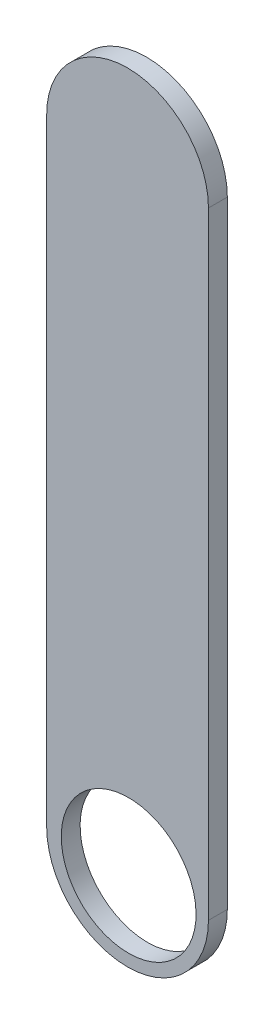
ISO-10303-21;
HEADER;
FILE_DESCRIPTION(('STEP AP214'),'2;1');
FILE_NAME('part.step','',(''),(''),'','','');
FILE_SCHEMA(('AUTOMOTIVE_DESIGN { 1 0 10303 214 1 1 1 1 }'));
ENDSEC;
DATA;
#1=APPLICATION_CONTEXT('core data for automotive mechanical design processes');
#2=APPLICATION_PROTOCOL_DEFINITION('international standard','automotive_design',2000,#1);
#3=PRODUCT_CONTEXT('',#1,'mechanical');
#4=PRODUCT('Part','Part','',(#3));
#5=PRODUCT_RELATED_PRODUCT_CATEGORY('part','',(#4));
#6=PRODUCT_DEFINITION_FORMATION('','',#4);
#7=PRODUCT_DEFINITION_CONTEXT('part definition',#1,'design');
#8=PRODUCT_DEFINITION('design','',#6,#7);
#9=PRODUCT_DEFINITION_SHAPE('','',#8);
#10=(LENGTH_UNIT() NAMED_UNIT(*) SI_UNIT(.MILLI.,.METRE.));
#11=(NAMED_UNIT(*) PLANE_ANGLE_UNIT() SI_UNIT($,.RADIAN.));
#12=(NAMED_UNIT(*) SI_UNIT($,.STERADIAN.) SOLID_ANGLE_UNIT());
#13=UNCERTAINTY_MEASURE_WITH_UNIT(LENGTH_MEASURE(1.E-05),#10,'distance_accuracy_value','');
#14=(GEOMETRIC_REPRESENTATION_CONTEXT(3) GLOBAL_UNCERTAINTY_ASSIGNED_CONTEXT((#13)) GLOBAL_UNIT_ASSIGNED_CONTEXT((#10,
#11,#12)) REPRESENTATION_CONTEXT('',''));
#15=CARTESIAN_POINT('',(0.,0.,0.));
#16=DIRECTION('',(0.,0.,1.));
#17=DIRECTION('',(1.,0.,0.));
#18=AXIS2_PLACEMENT_3D('',#15,#16,#17);
#19=CARTESIAN_POINT('',(132.67,-119.85,-0.045));
#20=DIRECTION('',(0.,0.,-1.));
#21=DIRECTION('',(0.,-1.,0.));
#22=AXIS2_PLACEMENT_3D('',#19,#20,#21);
#23=CYLINDRICAL_SURFACE('',#22,0.125);
#24=CARTESIAN_POINT('',(132.67,-119.85,1.6));
#25=DIRECTION('',(0.,0.,-1.));
#26=DIRECTION('',(0.,-1.,0.));
#27=AXIS2_PLACEMENT_3D('',#24,#25,#26);
#28=CIRCLE('',#27,0.125);
#29=CARTESIAN_POINT('',(132.67,-119.975,1.6));
#30=VERTEX_POINT('',#29);
#31=EDGE_CURVE('E126',#30,#30,#28,.T.);
#32=ORIENTED_EDGE('',*,*,#31,.T.);
#33=DIRECTION('',(0.,0.,1.));
#34=VECTOR('',#33,1.);
#35=CARTESIAN_POINT('',(132.67,-119.975,-0.045));
#36=LINE('',#35,#34);
#37=CARTESIAN_POINT('',(132.67,-119.975,1.635));
#38=VERTEX_POINT('',#37);
#39=EDGE_CURVE('E11',#30,#38,#36,.T.);
#40=ORIENTED_EDGE('',*,*,#39,.T.);
#41=CARTESIAN_POINT('',(132.67,-119.85,1.635));
#42=DIRECTION('',(0.,0.,-1.));
#43=DIRECTION('',(0.,-1.,0.));
#44=AXIS2_PLACEMENT_3D('',#41,#42,#43);
#45=CIRCLE('',#44,0.125);
#46=EDGE_CURVE('E20',#38,#38,#45,.T.);
#47=ORIENTED_EDGE('',*,*,#46,.F.);
#48=ORIENTED_EDGE('',*,*,#39,.F.);
#49=EDGE_LOOP('',(#32,#40,#47,#48));
#50=FACE_BOUND('',#49,.T.);
#51=ADVANCED_FACE('F17',(#50),#23,.F.);
#52=CARTESIAN_POINT('',(132.818,-119.848,1.6));
#53=DIRECTION('',(-1.,0.,0.));
#54=DIRECTION('',(0.,0.,1.));
#55=AXIS2_PLACEMENT_3D('',#52,#53,#54);
#56=PLANE('',#55);
#57=DIRECTION('',(0.,1.,0.));
#58=VECTOR('',#57,1.);
#59=CARTESIAN_POINT('',(132.818,-119.848,1.6));
#60=LINE('',#59,#58);
#61=CARTESIAN_POINT('',(132.818,-119.848,1.6));
#62=VERTEX_POINT('',#61);
#63=CARTESIAN_POINT('',(132.818,-118.704,1.6));
#64=VERTEX_POINT('',#63);
#65=EDGE_CURVE('E57',#62,#64,#60,.T.);
#66=ORIENTED_EDGE('',*,*,#65,.T.);
#67=DIRECTION('',(0.,0.,1.));
#68=VECTOR('',#67,1.);
#69=CARTESIAN_POINT('',(132.818,-118.704,1.6));
#70=LINE('',#69,#68);
#71=CARTESIAN_POINT('',(132.818,-118.704,1.635));
#72=VERTEX_POINT('',#71);
#73=EDGE_CURVE('E92',#64,#72,#70,.T.);
#74=ORIENTED_EDGE('',*,*,#73,.T.);
#75=DIRECTION('',(0.,1.,0.));
#76=VECTOR('',#75,1.);
#77=CARTESIAN_POINT('',(132.818,-119.848,1.635));
#78=LINE('',#77,#76);
#79=CARTESIAN_POINT('',(132.818,-119.848,1.635));
#80=VERTEX_POINT('',#79);
#81=EDGE_CURVE('E68',#80,#72,#78,.T.);
#82=ORIENTED_EDGE('',*,*,#81,.F.);
#83=DIRECTION('',(0.,0.,1.));
#84=VECTOR('',#83,1.);
#85=CARTESIAN_POINT('',(132.818,-119.848,1.6));
#86=LINE('',#85,#84);
#87=EDGE_CURVE('E122',#62,#80,#86,.T.);
#88=ORIENTED_EDGE('',*,*,#87,.F.);
#89=EDGE_LOOP('',(#66,#74,#82,#88));
#90=FACE_BOUND('',#89,.T.);
#91=ADVANCED_FACE('F162',(#90),#56,.F.);
#92=CARTESIAN_POINT('',(132.518,-118.704,1.635));
#93=DIRECTION('',(0.,0.,1.));
#94=DIRECTION('',(1.,0.,0.));
#95=AXIS2_PLACEMENT_3D('',#92,#93,#94);
#96=PLANE('',#95);
#97=ORIENTED_EDGE('',*,*,#46,.T.);
#98=EDGE_LOOP('',(#97));
#99=FACE_BOUND('',#98,.T.);
#100=DIRECTION('',(0.,-1.,0.));
#101=VECTOR('',#100,1.);
#102=CARTESIAN_POINT('',(132.518,-118.704,1.635));
#103=LINE('',#102,#101);
#104=CARTESIAN_POINT('',(132.518,-118.704,1.635));
#105=VERTEX_POINT('',#104);
#106=CARTESIAN_POINT('',(132.518,-119.848,1.635));
#107=VERTEX_POINT('',#106);
#108=EDGE_CURVE('E87',#105,#107,#103,.T.);
#109=ORIENTED_EDGE('',*,*,#108,.T.);
#110=CARTESIAN_POINT('',(132.668,-119.848,1.635));
#111=DIRECTION('',(0.,0.,1.));
#112=DIRECTION('',(-1.,0.,0.));
#113=AXIS2_PLACEMENT_3D('',#110,#111,#112);
#114=CIRCLE('',#113,0.15);
#115=EDGE_CURVE('E116',#107,#80,#114,.T.);
#116=ORIENTED_EDGE('',*,*,#115,.T.);
#117=ORIENTED_EDGE('',*,*,#81,.T.);
#118=CARTESIAN_POINT('',(132.668,-118.704,1.635));
#119=DIRECTION('',(0.,0.,1.));
#120=DIRECTION('',(1.,0.,0.));
#121=AXIS2_PLACEMENT_3D('',#118,#119,#120);
#122=CIRCLE('',#121,0.15);
#123=EDGE_CURVE('E83',#72,#105,#122,.T.);
#124=ORIENTED_EDGE('',*,*,#123,.T.);
#125=EDGE_LOOP('',(#109,#116,#117,#124));
#126=FACE_BOUND('',#125,.T.);
#127=ADVANCED_FACE('F85',(#99,#126),#96,.T.);
#128=CARTESIAN_POINT('',(132.518,-118.704,1.6));
#129=DIRECTION('',(0.,0.,1.));
#130=DIRECTION('',(1.,0.,0.));
#131=AXIS2_PLACEMENT_3D('',#128,#129,#130);
#132=PLANE('',#131);
#133=ORIENTED_EDGE('',*,*,#31,.F.);
#134=EDGE_LOOP('',(#133));
#135=FACE_BOUND('',#134,.T.);
#136=CARTESIAN_POINT('',(132.668,-118.704,1.6));
#137=DIRECTION('',(0.,0.,1.));
#138=DIRECTION('',(1.,0.,0.));
#139=AXIS2_PLACEMENT_3D('',#136,#137,#138);
#140=CIRCLE('',#139,0.15);
#141=CARTESIAN_POINT('',(132.518,-118.704,1.6));
#142=VERTEX_POINT('',#141);
#143=EDGE_CURVE('E93',#64,#142,#140,.T.);
#144=ORIENTED_EDGE('',*,*,#143,.F.);
#145=ORIENTED_EDGE('',*,*,#65,.F.);
#146=CARTESIAN_POINT('',(132.668,-119.848,1.6));
#147=DIRECTION('',(0.,0.,1.));
#148=DIRECTION('',(-1.,0.,0.));
#149=AXIS2_PLACEMENT_3D('',#146,#147,#148);
#150=CIRCLE('',#149,0.15);
#151=CARTESIAN_POINT('',(132.518,-119.848,1.6));
#152=VERTEX_POINT('',#151);
#153=EDGE_CURVE('E118',#152,#62,#150,.T.);
#154=ORIENTED_EDGE('',*,*,#153,.F.);
#155=DIRECTION('',(0.,-1.,0.));
#156=VECTOR('',#155,1.);
#157=CARTESIAN_POINT('',(132.518,-118.704,1.6));
#158=LINE('',#157,#156);
#159=EDGE_CURVE('E113',#142,#152,#158,.T.);
#160=ORIENTED_EDGE('',*,*,#159,.F.);
#161=EDGE_LOOP('',(#144,#145,#154,#160));
#162=FACE_BOUND('',#161,.T.);
#163=ADVANCED_FACE('F136',(#135,#162),#132,.F.);
#164=CARTESIAN_POINT('',(132.668,-119.848,1.6));
#165=DIRECTION('',(0.,0.,-1.));
#166=DIRECTION('',(-1.,0.,0.));
#167=AXIS2_PLACEMENT_3D('',#164,#165,#166);
#168=CYLINDRICAL_SURFACE('',#167,0.15);
#169=ORIENTED_EDGE('',*,*,#153,.T.);
#170=ORIENTED_EDGE('',*,*,#87,.T.);
#171=ORIENTED_EDGE('',*,*,#115,.F.);
#172=DIRECTION('',(0.,0.,1.));
#173=VECTOR('',#172,1.);
#174=CARTESIAN_POINT('',(132.518,-119.848,1.6));
#175=LINE('',#174,#173);
#176=EDGE_CURVE('E106',#152,#107,#175,.T.);
#177=ORIENTED_EDGE('',*,*,#176,.F.);
#178=EDGE_LOOP('',(#169,#170,#171,#177));
#179=FACE_BOUND('',#178,.T.);
#180=ADVANCED_FACE('F138',(#179),#168,.T.);
#181=CARTESIAN_POINT('',(132.668,-118.704,1.6));
#182=DIRECTION('',(0.,0.,-1.));
#183=DIRECTION('',(1.,0.,0.));
#184=AXIS2_PLACEMENT_3D('',#181,#182,#183);
#185=CYLINDRICAL_SURFACE('',#184,0.15);
#186=ORIENTED_EDGE('',*,*,#143,.T.);
#187=DIRECTION('',(0.,0.,1.));
#188=VECTOR('',#187,1.);
#189=CARTESIAN_POINT('',(132.518,-118.704,1.6));
#190=LINE('',#189,#188);
#191=EDGE_CURVE('E97',#142,#105,#190,.T.);
#192=ORIENTED_EDGE('',*,*,#191,.T.);
#193=ORIENTED_EDGE('',*,*,#123,.F.);
#194=ORIENTED_EDGE('',*,*,#73,.F.);
#195=EDGE_LOOP('',(#186,#192,#193,#194));
#196=FACE_BOUND('',#195,.T.);
#197=ADVANCED_FACE('F98',(#196),#185,.T.);
#198=CARTESIAN_POINT('',(132.518,-118.704,1.6));
#199=DIRECTION('',(1.,0.,0.));
#200=DIRECTION('',(0.,1.,0.));
#201=AXIS2_PLACEMENT_3D('',#198,#199,#200);
#202=PLANE('',#201);
#203=ORIENTED_EDGE('',*,*,#159,.T.);
#204=ORIENTED_EDGE('',*,*,#176,.T.);
#205=ORIENTED_EDGE('',*,*,#108,.F.);
#206=ORIENTED_EDGE('',*,*,#191,.F.);
#207=EDGE_LOOP('',(#203,#204,#205,#206));
#208=FACE_BOUND('',#207,.T.);
#209=ADVANCED_FACE('F104',(#208),#202,.F.);
#210=CLOSED_SHELL('',(#51,#91,#127,#163,#180,#197,#209));
#211=MANIFOLD_SOLID_BREP('B1',#210);
#212=ADVANCED_BREP_SHAPE_REPRESENTATION('',(#18,#211),#14);
#213=SHAPE_DEFINITION_REPRESENTATION(#9,#212);
ENDSEC;
END-ISO-10303-21;
